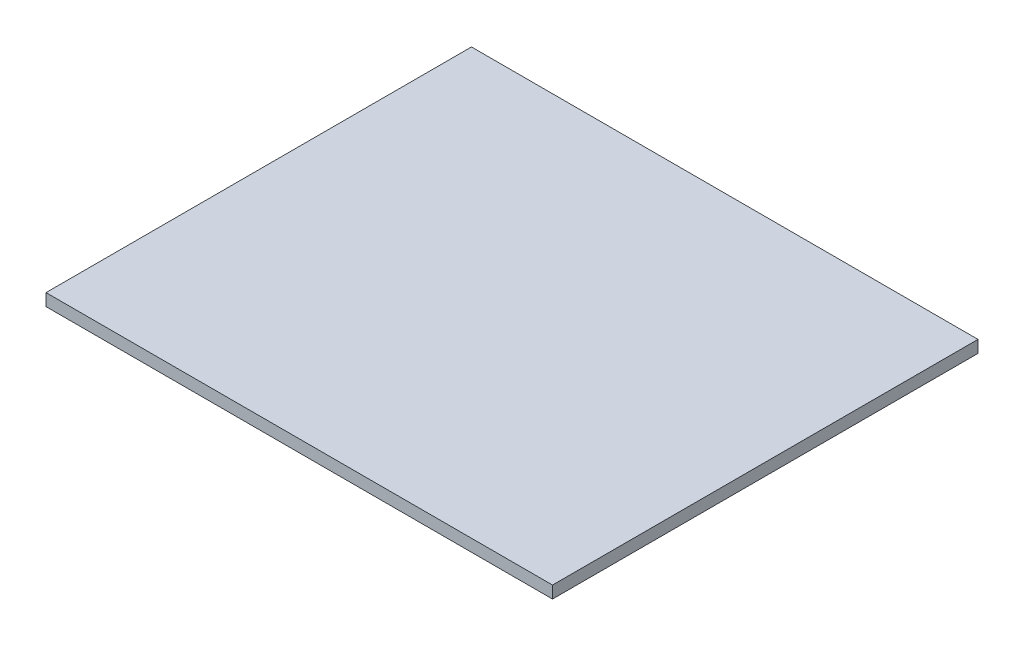
ISO-10303-21;
HEADER;
FILE_DESCRIPTION(('STEP AP214'),'2;1');
FILE_NAME('part.step','',(''),(''),'','','');
FILE_SCHEMA(('AUTOMOTIVE_DESIGN { 1 0 10303 214 1 1 1 1 }'));
ENDSEC;
DATA;
#1=APPLICATION_CONTEXT('core data for automotive mechanical design processes');
#2=APPLICATION_PROTOCOL_DEFINITION('international standard','automotive_design',2000,#1);
#3=PRODUCT_CONTEXT('',#1,'mechanical');
#4=PRODUCT('Part','Part','',(#3));
#5=PRODUCT_RELATED_PRODUCT_CATEGORY('part','',(#4));
#6=PRODUCT_DEFINITION_FORMATION('','',#4);
#7=PRODUCT_DEFINITION_CONTEXT('part definition',#1,'design');
#8=PRODUCT_DEFINITION('design','',#6,#7);
#9=PRODUCT_DEFINITION_SHAPE('','',#8);
#10=(LENGTH_UNIT() NAMED_UNIT(*) SI_UNIT(.MILLI.,.METRE.));
#11=(NAMED_UNIT(*) PLANE_ANGLE_UNIT() SI_UNIT($,.RADIAN.));
#12=(NAMED_UNIT(*) SI_UNIT($,.STERADIAN.) SOLID_ANGLE_UNIT());
#13=UNCERTAINTY_MEASURE_WITH_UNIT(LENGTH_MEASURE(1.E-05),#10,'distance_accuracy_value','');
#14=(GEOMETRIC_REPRESENTATION_CONTEXT(3) GLOBAL_UNCERTAINTY_ASSIGNED_CONTEXT((#13)) GLOBAL_UNIT_ASSIGNED_CONTEXT((#10,
#11,#12)) REPRESENTATION_CONTEXT('',''));
#15=CARTESIAN_POINT('',(0.,0.,0.));
#16=DIRECTION('',(0.,0.,1.));
#17=DIRECTION('',(1.,0.,0.));
#18=AXIS2_PLACEMENT_3D('',#15,#16,#17);
#19=CARTESIAN_POINT('',(62.5,3.,75.));
#20=DIRECTION('',(-1.,0.,0.));
#21=DIRECTION('',(0.,0.,1.));
#22=AXIS2_PLACEMENT_3D('',#19,#20,#21);
#23=PLANE('',#22);
#24=DIRECTION('',(0.,0.,-1.));
#25=VECTOR('',#24,1.);
#26=CARTESIAN_POINT('',(62.5,0.,75.));
#27=LINE('',#26,#25);
#28=CARTESIAN_POINT('',(62.5,0.,75.));
#29=VERTEX_POINT('',#28);
#30=CARTESIAN_POINT('',(62.5,0.,-30.));
#31=VERTEX_POINT('',#30);
#32=EDGE_CURVE('E113',#29,#31,#27,.T.);
#33=ORIENTED_EDGE('',*,*,#32,.T.);
#34=DIRECTION('',(0.,-1.,0.));
#35=VECTOR('',#34,1.);
#36=CARTESIAN_POINT('',(62.5,3.,-30.));
#37=LINE('',#36,#35);
#38=CARTESIAN_POINT('',(62.5,3.,-30.));
#39=VERTEX_POINT('',#38);
#40=EDGE_CURVE('E11',#39,#31,#37,.T.);
#41=ORIENTED_EDGE('',*,*,#40,.F.);
#42=DIRECTION('',(0.,0.,-1.));
#43=VECTOR('',#42,1.);
#44=CARTESIAN_POINT('',(62.5,3.,75.));
#45=LINE('',#44,#43);
#46=CARTESIAN_POINT('',(62.5,3.,75.));
#47=VERTEX_POINT('',#46);
#48=EDGE_CURVE('E97',#47,#39,#45,.T.);
#49=ORIENTED_EDGE('',*,*,#48,.F.);
#50=DIRECTION('',(0.,-1.,0.));
#51=VECTOR('',#50,1.);
#52=CARTESIAN_POINT('',(62.5,3.,75.));
#53=LINE('',#52,#51);
#54=EDGE_CURVE('E109',#47,#29,#53,.T.);
#55=ORIENTED_EDGE('',*,*,#54,.T.);
#56=EDGE_LOOP('',(#33,#41,#49,#55));
#57=FACE_BOUND('',#56,.T.);
#58=ADVANCED_FACE('F45',(#57),#23,.F.);
#59=CARTESIAN_POINT('',(-62.5,3.,-30.));
#60=DIRECTION('',(0.,0.,1.));
#61=DIRECTION('',(1.,0.,0.));
#62=AXIS2_PLACEMENT_3D('',#59,#60,#61);
#63=PLANE('',#62);
#64=DIRECTION('',(-1.,0.,0.));
#65=VECTOR('',#64,1.);
#66=CARTESIAN_POINT('',(-62.5,0.,-30.));
#67=LINE('',#66,#65);
#68=CARTESIAN_POINT('',(-62.5,0.,-30.));
#69=VERTEX_POINT('',#68);
#70=EDGE_CURVE('E102',#31,#69,#67,.T.);
#71=ORIENTED_EDGE('',*,*,#70,.T.);
#72=DIRECTION('',(0.,-1.,0.));
#73=VECTOR('',#72,1.);
#74=CARTESIAN_POINT('',(-62.5,3.,-30.));
#75=LINE('',#74,#73);
#76=CARTESIAN_POINT('',(-62.5,3.,-30.));
#77=VERTEX_POINT('',#76);
#78=EDGE_CURVE('E54',#77,#69,#75,.T.);
#79=ORIENTED_EDGE('',*,*,#78,.F.);
#80=DIRECTION('',(-1.,0.,0.));
#81=VECTOR('',#80,1.);
#82=CARTESIAN_POINT('',(-62.5,3.,-30.));
#83=LINE('',#82,#81);
#84=EDGE_CURVE('E92',#39,#77,#83,.T.);
#85=ORIENTED_EDGE('',*,*,#84,.F.);
#86=ORIENTED_EDGE('',*,*,#40,.T.);
#87=EDGE_LOOP('',(#71,#79,#85,#86));
#88=FACE_BOUND('',#87,.T.);
#89=ADVANCED_FACE('F101',(#88),#63,.F.);
#90=CARTESIAN_POINT('',(-62.5,3.,75.));
#91=DIRECTION('',(1.,0.,0.));
#92=DIRECTION('',(0.,0.,-1.));
#93=AXIS2_PLACEMENT_3D('',#90,#91,#92);
#94=PLANE('',#93);
#95=DIRECTION('',(0.,0.,1.));
#96=VECTOR('',#95,1.);
#97=CARTESIAN_POINT('',(-62.5,0.,75.));
#98=LINE('',#97,#96);
#99=CARTESIAN_POINT('',(-62.5,0.,75.));
#100=VERTEX_POINT('',#99);
#101=EDGE_CURVE('E79',#69,#100,#98,.T.);
#102=ORIENTED_EDGE('',*,*,#101,.T.);
#103=DIRECTION('',(0.,-1.,0.));
#104=VECTOR('',#103,1.);
#105=CARTESIAN_POINT('',(-62.5,3.,75.));
#106=LINE('',#105,#104);
#107=CARTESIAN_POINT('',(-62.5,3.,75.));
#108=VERTEX_POINT('',#107);
#109=EDGE_CURVE('E104',#108,#100,#106,.T.);
#110=ORIENTED_EDGE('',*,*,#109,.F.);
#111=DIRECTION('',(0.,0.,1.));
#112=VECTOR('',#111,1.);
#113=CARTESIAN_POINT('',(-62.5,3.,75.));
#114=LINE('',#113,#112);
#115=EDGE_CURVE('E95',#77,#108,#114,.T.);
#116=ORIENTED_EDGE('',*,*,#115,.F.);
#117=ORIENTED_EDGE('',*,*,#78,.T.);
#118=EDGE_LOOP('',(#102,#110,#116,#117));
#119=FACE_BOUND('',#118,.T.);
#120=ADVANCED_FACE('F105',(#119),#94,.F.);
#121=CARTESIAN_POINT('',(-62.5,3.,75.));
#122=DIRECTION('',(0.,0.,-1.));
#123=DIRECTION('',(-1.,0.,0.));
#124=AXIS2_PLACEMENT_3D('',#121,#122,#123);
#125=PLANE('',#124);
#126=DIRECTION('',(1.,0.,0.));
#127=VECTOR('',#126,1.);
#128=CARTESIAN_POINT('',(-62.5,0.,75.));
#129=LINE('',#128,#127);
#130=EDGE_CURVE('E85',#100,#29,#129,.T.);
#131=ORIENTED_EDGE('',*,*,#130,.T.);
#132=ORIENTED_EDGE('',*,*,#54,.F.);
#133=DIRECTION('',(1.,0.,0.));
#134=VECTOR('',#133,1.);
#135=CARTESIAN_POINT('',(-62.5,3.,75.));
#136=LINE('',#135,#134);
#137=EDGE_CURVE('E62',#108,#47,#136,.T.);
#138=ORIENTED_EDGE('',*,*,#137,.F.);
#139=ORIENTED_EDGE('',*,*,#109,.T.);
#140=EDGE_LOOP('',(#131,#132,#138,#139));
#141=FACE_BOUND('',#140,.T.);
#142=ADVANCED_FACE('F126',(#141),#125,.F.);
#143=CARTESIAN_POINT('',(0.,3.,0.));
#144=DIRECTION('',(0.,-1.,0.));
#145=DIRECTION('',(0.,0.,-1.));
#146=AXIS2_PLACEMENT_3D('',#143,#144,#145);
#147=PLANE('',#146);
#148=ORIENTED_EDGE('',*,*,#48,.T.);
#149=ORIENTED_EDGE('',*,*,#84,.T.);
#150=ORIENTED_EDGE('',*,*,#115,.T.);
#151=ORIENTED_EDGE('',*,*,#137,.T.);
#152=EDGE_LOOP('',(#148,#149,#150,#151));
#153=FACE_BOUND('',#152,.T.);
#154=ADVANCED_FACE('F93',(#153),#147,.F.);
#155=CARTESIAN_POINT('',(0.,0.,0.));
#156=DIRECTION('',(0.,-1.,0.));
#157=DIRECTION('',(0.,0.,-1.));
#158=AXIS2_PLACEMENT_3D('',#155,#156,#157);
#159=PLANE('',#158);
#160=ORIENTED_EDGE('',*,*,#32,.F.);
#161=ORIENTED_EDGE('',*,*,#130,.F.);
#162=ORIENTED_EDGE('',*,*,#101,.F.);
#163=ORIENTED_EDGE('',*,*,#70,.F.);
#164=EDGE_LOOP('',(#160,#161,#162,#163));
#165=FACE_BOUND('',#164,.T.);
#166=ADVANCED_FACE('F129',(#165),#159,.T.);
#167=CLOSED_SHELL('',(#58,#89,#120,#142,#154,#166));
#168=MANIFOLD_SOLID_BREP('B2',#167);
#169=ADVANCED_BREP_SHAPE_REPRESENTATION('',(#18,#168),#14);
#170=SHAPE_DEFINITION_REPRESENTATION(#9,#169);
ENDSEC;
END-ISO-10303-21;
